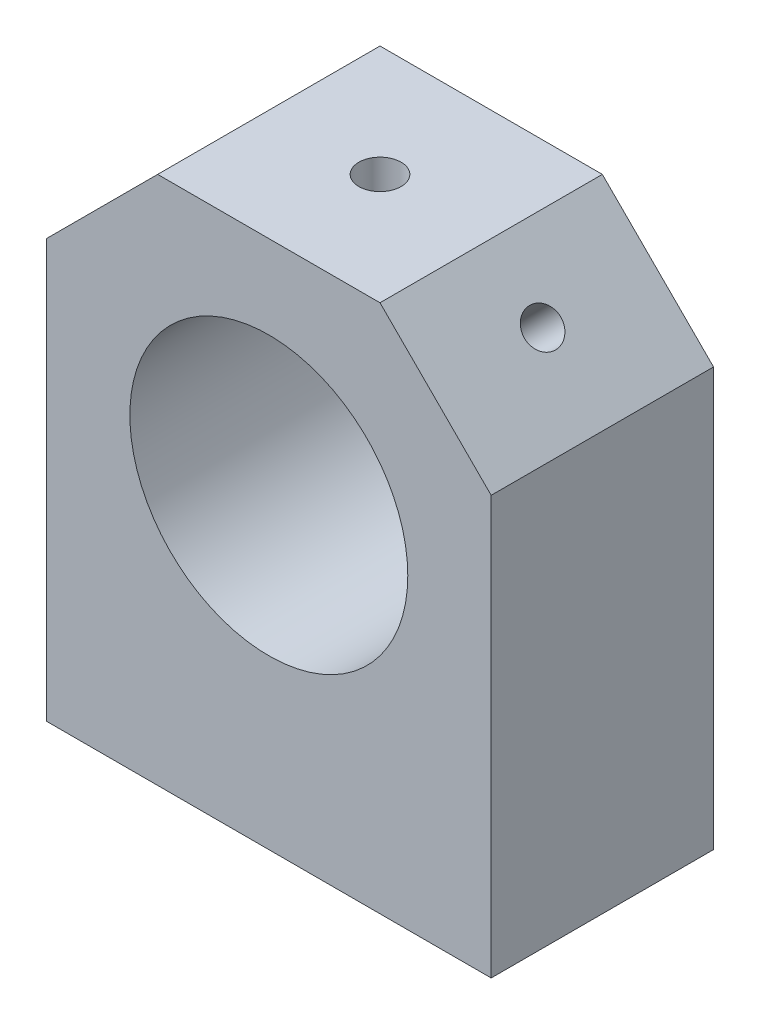
ISO-10303-21;
HEADER;
FILE_DESCRIPTION(('STEP AP214'),'2;1');
FILE_NAME('part.step','',(''),(''),'','','');
FILE_SCHEMA(('AUTOMOTIVE_DESIGN { 1 0 10303 214 1 1 1 1 }'));
ENDSEC;
DATA;
#1=APPLICATION_CONTEXT('core data for automotive mechanical design processes');
#2=APPLICATION_PROTOCOL_DEFINITION('international standard','automotive_design',2000,#1);
#3=PRODUCT_CONTEXT('',#1,'mechanical');
#4=PRODUCT('Part','Part','',(#3));
#5=PRODUCT_RELATED_PRODUCT_CATEGORY('part','',(#4));
#6=PRODUCT_DEFINITION_FORMATION('','',#4);
#7=PRODUCT_DEFINITION_CONTEXT('part definition',#1,'design');
#8=PRODUCT_DEFINITION('design','',#6,#7);
#9=PRODUCT_DEFINITION_SHAPE('','',#8);
#10=(LENGTH_UNIT() NAMED_UNIT(*) SI_UNIT(.MILLI.,.METRE.));
#11=(NAMED_UNIT(*) PLANE_ANGLE_UNIT() SI_UNIT($,.RADIAN.));
#12=(NAMED_UNIT(*) SI_UNIT($,.STERADIAN.) SOLID_ANGLE_UNIT());
#13=UNCERTAINTY_MEASURE_WITH_UNIT(LENGTH_MEASURE(1.E-05),#10,'distance_accuracy_value','');
#14=(GEOMETRIC_REPRESENTATION_CONTEXT(3) GLOBAL_UNCERTAINTY_ASSIGNED_CONTEXT((#13)) GLOBAL_UNIT_ASSIGNED_CONTEXT((#10,
#11,#12)) REPRESENTATION_CONTEXT('',''));
#15=CARTESIAN_POINT('',(0.,0.,0.));
#16=DIRECTION('',(0.,0.,1.));
#17=DIRECTION('',(1.,0.,0.));
#18=AXIS2_PLACEMENT_3D('',#15,#16,#17);
#19=CARTESIAN_POINT('',(0.,0.,25.4));
#20=DIRECTION('',(0.,0.,1.));
#21=DIRECTION('',(1.,0.,0.));
#22=AXIS2_PLACEMENT_3D('',#19,#20,#21);
#23=PLANE('',#22);
#24=DIRECTION('',(0.,1.,0.));
#25=VECTOR('',#24,1.);
#26=CARTESIAN_POINT('',(0.,0.,25.4));
#27=LINE('',#26,#25);
#28=CARTESIAN_POINT('',(0.,0.,25.4));
#29=VERTEX_POINT('',#28);
#30=CARTESIAN_POINT('',(0.,47.752,25.4));
#31=VERTEX_POINT('',#30);
#32=EDGE_CURVE('E157',#29,#31,#27,.T.);
#33=ORIENTED_EDGE('',*,*,#32,.T.);
#34=DIRECTION('',(-0.707106781186552,0.707106781186543,0.));
#35=VECTOR('',#34,1.);
#36=CARTESIAN_POINT('',(-12.7000000000001,60.452,25.4));
#37=LINE('',#36,#35);
#38=CARTESIAN_POINT('',(-12.7000000000001,60.452,25.4));
#39=VERTEX_POINT('',#38);
#40=EDGE_CURVE('E105',#31,#39,#37,.T.);
#41=ORIENTED_EDGE('',*,*,#40,.T.);
#42=DIRECTION('',(-1.,0.,0.));
#43=VECTOR('',#42,1.);
#44=CARTESIAN_POINT('',(-12.7000000000001,60.452,25.4));
#45=LINE('',#44,#43);
#46=CARTESIAN_POINT('',(-38.1000000000001,60.452,25.4));
#47=VERTEX_POINT('',#46);
#48=EDGE_CURVE('E118',#39,#47,#45,.T.);
#49=ORIENTED_EDGE('',*,*,#48,.T.);
#50=DIRECTION('',(-0.707106781186546,-0.707106781186549,0.));
#51=VECTOR('',#50,1.);
#52=CARTESIAN_POINT('',(-38.1000000000001,60.452,25.4));
#53=LINE('',#52,#51);
#54=CARTESIAN_POINT('',(-50.8,47.752,25.4));
#55=VERTEX_POINT('',#54);
#56=EDGE_CURVE('E112',#47,#55,#53,.T.);
#57=ORIENTED_EDGE('',*,*,#56,.T.);
#58=DIRECTION('',(0.,-1.,0.));
#59=VECTOR('',#58,1.);
#60=CARTESIAN_POINT('',(-50.8,0.,25.4));
#61=LINE('',#60,#59);
#62=CARTESIAN_POINT('',(-50.8,0.,25.4));
#63=VERTEX_POINT('',#62);
#64=EDGE_CURVE('E116',#55,#63,#61,.T.);
#65=ORIENTED_EDGE('',*,*,#64,.T.);
#66=DIRECTION('',(1.,0.,0.));
#67=VECTOR('',#66,1.);
#68=CARTESIAN_POINT('',(0.,0.,25.4));
#69=LINE('',#68,#67);
#70=EDGE_CURVE('E68',#63,#29,#69,.T.);
#71=ORIENTED_EDGE('',*,*,#70,.T.);
#72=EDGE_LOOP('',(#33,#41,#49,#57,#65,#71));
#73=FACE_BOUND('',#72,.T.);
#74=CARTESIAN_POINT('',(-25.4,35.052,25.4));
#75=DIRECTION('',(0.,0.,1.));
#76=DIRECTION('',(1.,0.,0.));
#77=AXIS2_PLACEMENT_3D('',#74,#75,#76);
#78=CIRCLE('',#77,15.875);
#79=CARTESIAN_POINT('',(-9.525,35.052,25.4));
#80=VERTEX_POINT('',#79);
#81=EDGE_CURVE('E145',#80,#80,#78,.T.);
#82=ORIENTED_EDGE('',*,*,#81,.F.);
#83=EDGE_LOOP('',(#82));
#84=FACE_BOUND('',#83,.T.);
#85=ADVANCED_FACE('F43',(#73,#84),#23,.T.);
#86=CARTESIAN_POINT('',(0.,0.,0.));
#87=DIRECTION('',(0.,0.,1.));
#88=DIRECTION('',(1.,0.,0.));
#89=AXIS2_PLACEMENT_3D('',#86,#87,#88);
#90=PLANE('',#89);
#91=DIRECTION('',(0.,1.,0.));
#92=VECTOR('',#91,1.);
#93=CARTESIAN_POINT('',(0.,0.,0.));
#94=LINE('',#93,#92);
#95=CARTESIAN_POINT('',(0.,0.,0.));
#96=VERTEX_POINT('',#95);
#97=CARTESIAN_POINT('',(0.,47.752,0.));
#98=VERTEX_POINT('',#97);
#99=EDGE_CURVE('E140',#96,#98,#94,.T.);
#100=ORIENTED_EDGE('',*,*,#99,.F.);
#101=DIRECTION('',(1.,0.,0.));
#102=VECTOR('',#101,1.);
#103=CARTESIAN_POINT('',(0.,0.,0.));
#104=LINE('',#103,#102);
#105=CARTESIAN_POINT('',(-50.8,0.,0.));
#106=VERTEX_POINT('',#105);
#107=EDGE_CURVE('E97',#106,#96,#104,.T.);
#108=ORIENTED_EDGE('',*,*,#107,.F.);
#109=DIRECTION('',(0.,-1.,0.));
#110=VECTOR('',#109,1.);
#111=CARTESIAN_POINT('',(-50.8,0.,0.));
#112=LINE('',#111,#110);
#113=CARTESIAN_POINT('',(-50.8,47.752,0.));
#114=VERTEX_POINT('',#113);
#115=EDGE_CURVE('E91',#114,#106,#112,.T.);
#116=ORIENTED_EDGE('',*,*,#115,.F.);
#117=DIRECTION('',(-0.707106781186546,-0.707106781186549,0.));
#118=VECTOR('',#117,1.);
#119=CARTESIAN_POINT('',(-38.1000000000001,60.452,0.));
#120=LINE('',#119,#118);
#121=CARTESIAN_POINT('',(-38.1000000000001,60.452,0.));
#122=VERTEX_POINT('',#121);
#123=EDGE_CURVE('E127',#122,#114,#120,.T.);
#124=ORIENTED_EDGE('',*,*,#123,.F.);
#125=DIRECTION('',(-1.,0.,0.));
#126=VECTOR('',#125,1.);
#127=CARTESIAN_POINT('',(-12.7000000000001,60.452,0.));
#128=LINE('',#127,#126);
#129=CARTESIAN_POINT('',(-12.7000000000001,60.452,0.));
#130=VERTEX_POINT('',#129);
#131=EDGE_CURVE('E148',#130,#122,#128,.T.);
#132=ORIENTED_EDGE('',*,*,#131,.F.);
#133=DIRECTION('',(-0.707106781186552,0.707106781186543,0.));
#134=VECTOR('',#133,1.);
#135=CARTESIAN_POINT('',(-12.7000000000001,60.452,0.));
#136=LINE('',#135,#134);
#137=EDGE_CURVE('E144',#98,#130,#136,.T.);
#138=ORIENTED_EDGE('',*,*,#137,.F.);
#139=EDGE_LOOP('',(#100,#108,#116,#124,#132,#138));
#140=FACE_BOUND('',#139,.T.);
#141=CARTESIAN_POINT('',(-25.4,35.052,0.));
#142=DIRECTION('',(0.,0.,1.));
#143=DIRECTION('',(1.,0.,0.));
#144=AXIS2_PLACEMENT_3D('',#141,#142,#143);
#145=CIRCLE('',#144,15.875);
#146=CARTESIAN_POINT('',(-9.525,35.052,0.));
#147=VERTEX_POINT('',#146);
#148=EDGE_CURVE('E174',#147,#147,#145,.T.);
#149=ORIENTED_EDGE('',*,*,#148,.T.);
#150=EDGE_LOOP('',(#149));
#151=FACE_BOUND('',#150,.T.);
#152=ADVANCED_FACE('F201',(#140,#151),#90,.F.);
#153=CARTESIAN_POINT('',(0.,0.,25.4));
#154=DIRECTION('',(-1.,0.,0.));
#155=DIRECTION('',(0.,0.,1.));
#156=AXIS2_PLACEMENT_3D('',#153,#154,#155);
#157=PLANE('',#156);
#158=ORIENTED_EDGE('',*,*,#99,.T.);
#159=DIRECTION('',(0.,0.,-1.));
#160=VECTOR('',#159,1.);
#161=CARTESIAN_POINT('',(0.,47.752,25.4));
#162=LINE('',#161,#160);
#163=EDGE_CURVE('E11',#31,#98,#162,.T.);
#164=ORIENTED_EDGE('',*,*,#163,.F.);
#165=ORIENTED_EDGE('',*,*,#32,.F.);
#166=DIRECTION('',(0.,0.,-1.));
#167=VECTOR('',#166,1.);
#168=CARTESIAN_POINT('',(0.,0.,25.4));
#169=LINE('',#168,#167);
#170=EDGE_CURVE('E136',#29,#96,#169,.T.);
#171=ORIENTED_EDGE('',*,*,#170,.T.);
#172=EDGE_LOOP('',(#158,#164,#165,#171));
#173=FACE_BOUND('',#172,.T.);
#174=ADVANCED_FACE('F45',(#173),#157,.F.);
#175=CARTESIAN_POINT('',(-12.7000000000001,60.452,25.4));
#176=DIRECTION('',(-0.707106781186543,-0.707106781186552,0.));
#177=DIRECTION('',(0.707106781186552,-0.707106781186543,0.));
#178=AXIS2_PLACEMENT_3D('',#175,#176,#177);
#179=PLANE('',#178);
#180=CARTESIAN_POINT('',(-6.8249946520126,54.5769946520126,12.7));
#181=DIRECTION('',(0.707106781186543,0.707106781186552,0.));
#182=DIRECTION('',(-0.707106781186552,0.707106781186543,0.));
#183=AXIS2_PLACEMENT_3D('',#180,#181,#182);
#184=CIRCLE('',#183,2.08279999999999);
#185=CARTESIAN_POINT('',(-8.29775665586794,56.0497566558679,12.7));
#186=VERTEX_POINT('',#185);
#187=EDGE_CURVE('E228',#186,#186,#184,.T.);
#188=ORIENTED_EDGE('',*,*,#187,.F.);
#189=EDGE_LOOP('',(#188));
#190=FACE_BOUND('',#189,.T.);
#191=ORIENTED_EDGE('',*,*,#137,.T.);
#192=DIRECTION('',(0.,0.,-1.));
#193=VECTOR('',#192,1.);
#194=CARTESIAN_POINT('',(-12.7000000000001,60.452,25.4));
#195=LINE('',#194,#193);
#196=EDGE_CURVE('E59',#39,#130,#195,.T.);
#197=ORIENTED_EDGE('',*,*,#196,.F.);
#198=ORIENTED_EDGE('',*,*,#40,.F.);
#199=ORIENTED_EDGE('',*,*,#163,.T.);
#200=EDGE_LOOP('',(#191,#197,#198,#199));
#201=FACE_BOUND('',#200,.T.);
#202=ADVANCED_FACE('F218',(#190,#201),#179,.F.);
#203=CARTESIAN_POINT('',(-12.7000000000001,60.452,25.4));
#204=DIRECTION('',(0.,-1.,0.));
#205=DIRECTION('',(1.,0.,0.));
#206=AXIS2_PLACEMENT_3D('',#203,#204,#205);
#207=PLANE('',#206);
#208=CARTESIAN_POINT('',(-25.4000000000001,60.452,12.7));
#209=DIRECTION('',(0.,1.,0.));
#210=DIRECTION('',(0.,0.,1.));
#211=AXIS2_PLACEMENT_3D('',#208,#209,#210);
#212=CIRCLE('',#211,2.41299999999999);
#213=CARTESIAN_POINT('',(-25.4000000000001,60.452,15.113));
#214=VERTEX_POINT('',#213);
#215=EDGE_CURVE('E175',#214,#214,#212,.T.);
#216=ORIENTED_EDGE('',*,*,#215,.F.);
#217=EDGE_LOOP('',(#216));
#218=FACE_BOUND('',#217,.T.);
#219=ORIENTED_EDGE('',*,*,#131,.T.);
#220=DIRECTION('',(0.,0.,-1.));
#221=VECTOR('',#220,1.);
#222=CARTESIAN_POINT('',(-38.1000000000001,60.452,25.4));
#223=LINE('',#222,#221);
#224=EDGE_CURVE('E129',#47,#122,#223,.T.);
#225=ORIENTED_EDGE('',*,*,#224,.F.);
#226=ORIENTED_EDGE('',*,*,#48,.F.);
#227=ORIENTED_EDGE('',*,*,#196,.T.);
#228=EDGE_LOOP('',(#219,#225,#226,#227));
#229=FACE_BOUND('',#228,.T.);
#230=ADVANCED_FACE('F215',(#218,#229),#207,.F.);
#231=CARTESIAN_POINT('',(-38.1000000000001,60.452,25.4));
#232=DIRECTION('',(0.707106781186549,-0.707106781186546,0.));
#233=DIRECTION('',(0.707106781186546,0.707106781186549,0.));
#234=AXIS2_PLACEMENT_3D('',#231,#232,#233);
#235=PLANE('',#234);
#236=CARTESIAN_POINT('',(-44.9249946520126,53.6270053479874,12.7));
#237=DIRECTION('',(-0.707106781186549,0.707106781186546,0.));
#238=DIRECTION('',(-0.707106781186546,-0.707106781186549,0.));
#239=AXIS2_PLACEMENT_3D('',#236,#237,#238);
#240=CIRCLE('',#239,2.0828);
#241=CARTESIAN_POINT('',(-46.397756655868,52.1542433441321,12.7));
#242=VERTEX_POINT('',#241);
#243=EDGE_CURVE('E250',#242,#242,#240,.T.);
#244=ORIENTED_EDGE('',*,*,#243,.F.);
#245=EDGE_LOOP('',(#244));
#246=FACE_BOUND('',#245,.T.);
#247=ORIENTED_EDGE('',*,*,#123,.T.);
#248=DIRECTION('',(0.,0.,-1.));
#249=VECTOR('',#248,1.);
#250=CARTESIAN_POINT('',(-50.8,47.752,25.4));
#251=LINE('',#250,#249);
#252=EDGE_CURVE('E124',#55,#114,#251,.T.);
#253=ORIENTED_EDGE('',*,*,#252,.F.);
#254=ORIENTED_EDGE('',*,*,#56,.F.);
#255=ORIENTED_EDGE('',*,*,#224,.T.);
#256=EDGE_LOOP('',(#247,#253,#254,#255));
#257=FACE_BOUND('',#256,.T.);
#258=ADVANCED_FACE('F125',(#246,#257),#235,.F.);
#259=CARTESIAN_POINT('',(-50.8,0.,25.4));
#260=DIRECTION('',(1.,0.,0.));
#261=DIRECTION('',(0.,0.,-1.));
#262=AXIS2_PLACEMENT_3D('',#259,#260,#261);
#263=PLANE('',#262);
#264=ORIENTED_EDGE('',*,*,#115,.T.);
#265=DIRECTION('',(0.,0.,-1.));
#266=VECTOR('',#265,1.);
#267=CARTESIAN_POINT('',(-50.8,0.,25.4));
#268=LINE('',#267,#266);
#269=EDGE_CURVE('E130',#63,#106,#268,.T.);
#270=ORIENTED_EDGE('',*,*,#269,.F.);
#271=ORIENTED_EDGE('',*,*,#64,.F.);
#272=ORIENTED_EDGE('',*,*,#252,.T.);
#273=EDGE_LOOP('',(#264,#270,#271,#272));
#274=FACE_BOUND('',#273,.T.);
#275=ADVANCED_FACE('F132',(#274),#263,.F.);
#276=CARTESIAN_POINT('',(0.,0.,25.4));
#277=DIRECTION('',(0.,1.,0.));
#278=DIRECTION('',(0.,0.,1.));
#279=AXIS2_PLACEMENT_3D('',#276,#277,#278);
#280=PLANE('',#279);
#281=ORIENTED_EDGE('',*,*,#107,.T.);
#282=ORIENTED_EDGE('',*,*,#170,.F.);
#283=ORIENTED_EDGE('',*,*,#70,.F.);
#284=ORIENTED_EDGE('',*,*,#269,.T.);
#285=EDGE_LOOP('',(#281,#282,#283,#284));
#286=FACE_BOUND('',#285,.T.);
#287=ADVANCED_FACE('F208',(#286),#280,.F.);
#288=CARTESIAN_POINT('',(-25.4,35.052,25.4));
#289=DIRECTION('',(0.,0.,-1.));
#290=DIRECTION('',(-1.,0.,0.));
#291=AXIS2_PLACEMENT_3D('',#288,#289,#290);
#292=CYLINDRICAL_SURFACE('',#291,15.875);
#293=CARTESIAN_POINT('',(-16.2927100024375,48.0548033092983,12.7));
#294=CARTESIAN_POINT('',(-16.2927050720651,48.0548011733864,12.5840463750659));
#295=CARTESIAN_POINT('',(-16.2846217681134,48.0491498059719,12.4680211828327));
#296=CARTESIAN_POINT('',(-16.2525920227488,48.0266260256447,12.2392170107938));
#297=CARTESIAN_POINT('',(-16.2286291986686,48.0097420241175,12.1264415091625));
#298=CARTESIAN_POINT('',(-16.1658187770765,47.9650553099287,11.9074960299914));
#299=CARTESIAN_POINT('',(-16.1269842941601,47.9372622169286,11.8013203280233));
#300=CARTESIAN_POINT('',(-16.0359213861988,47.8712357421164,11.5984090323196));
#301=CARTESIAN_POINT('',(-15.9836948691861,47.833003847524,11.5016720965024));
#302=CARTESIAN_POINT('',(-15.8672040139145,47.7463581130501,11.3193783513828));
#303=CARTESIAN_POINT('',(-15.802834225104,47.6978545855876,11.2339315620008));
#304=CARTESIAN_POINT('',(-15.6646165575232,47.5917571950305,11.0775757665023));
#305=CARTESIAN_POINT('',(-15.5907678909041,47.534162576227,11.0066679700864));
#306=CARTESIAN_POINT('',(-15.4353198059716,47.4104270463784,10.8807497659083));
#307=CARTESIAN_POINT('',(-15.3536540760266,47.3442109129028,10.8258950044019));
#308=CARTESIAN_POINT('',(-15.1858326562051,47.2051179277914,10.7345759382728));
#309=CARTESIAN_POINT('',(-15.0996770793642,47.1322412438058,10.6981111709133));
#310=CARTESIAN_POINT('',(-14.9259554126967,46.9819264968628,10.644794560961));
#311=CARTESIAN_POINT('',(-14.8383966905746,46.9045086922687,10.6278616780001));
#312=CARTESIAN_POINT('',(-14.6641687889873,46.7469281713973,10.6138977021372));
#313=CARTESIAN_POINT('',(-14.5774995531169,46.6667656305886,10.6168653393673));
#314=CARTESIAN_POINT('',(-14.4083757490239,46.5068348175603,10.6425389689042));
#315=CARTESIAN_POINT('',(-14.3258883709987,46.4270703012398,10.6650525766123));
#316=CARTESIAN_POINT('',(-14.166421309728,46.2696155200845,10.7289346745719));
#317=CARTESIAN_POINT('',(-14.0894415715107,46.1919252345515,10.7703029766042));
#318=CARTESIAN_POINT('',(-13.9430367111155,46.0412965059779,10.8706021412744));
#319=CARTESIAN_POINT('',(-13.8735954793047,45.9683480692185,10.929494505181));
#320=CARTESIAN_POINT('',(-13.7436183832162,45.8294512040953,11.0632074635144));
#321=CARTESIAN_POINT('',(-13.6830828222893,45.7635030141998,11.1380286003054));
#322=CARTESIAN_POINT('',(-13.5718452981218,45.64054605993,11.301953595574));
#323=CARTESIAN_POINT('',(-13.5211988589373,45.5835880965669,11.3911332430368));
#324=CARTESIAN_POINT('',(-13.4311140468052,45.4810970130984,11.5809804822694));
#325=CARTESIAN_POINT('',(-13.3916758634065,45.4355640862095,11.6816482682811));
#326=CARTESIAN_POINT('',(-13.3246079566339,45.3574937722672,11.8919800888176));
#327=CARTESIAN_POINT('',(-13.2970151900869,45.3249970776725,12.0016710245678));
#328=CARTESIAN_POINT('',(-13.2542950719204,45.2744547595542,12.2266656653231));
#329=CARTESIAN_POINT('',(-13.2391674301241,45.2564087996308,12.341969239605));
#330=CARTESIAN_POINT('',(-13.2216596407273,45.2355082373085,12.5745528489555));
#331=CARTESIAN_POINT('',(-13.2192420332007,45.2326089935778,12.6918260528759));
#332=CARTESIAN_POINT('',(-13.2270940184724,45.2419961107811,12.9253340932832));
#333=CARTESIAN_POINT('',(-13.2373634769194,45.2542823109068,13.0415689407528));
#334=CARTESIAN_POINT('',(-13.2703822625837,45.2935158434956,13.2694593697312));
#335=CARTESIAN_POINT('',(-13.2931061559933,45.3204332958463,13.3811237869689));
#336=CARTESIAN_POINT('',(-13.3506306754186,45.3878732866736,13.5969841559818));
#337=CARTESIAN_POINT('',(-13.385431602405,45.4283961642089,13.7011799215533));
#338=CARTESIAN_POINT('',(-13.4666253797125,45.5216712145351,13.8994905512324));
#339=CARTESIAN_POINT('',(-13.5130530601735,45.574460097553,13.9935738890156));
#340=CARTESIAN_POINT('',(-13.6165885495664,45.690273199898,14.1686572672583));
#341=CARTESIAN_POINT('',(-13.6736965147126,45.7532975689319,14.249657116321));
#342=CARTESIAN_POINT('',(-13.7975719391149,45.8874799155307,14.396423595293));
#343=CARTESIAN_POINT('',(-13.8643572788231,45.9586528966834,14.4621614280387));
#344=CARTESIAN_POINT('',(-14.0060454746993,46.1065872805162,14.5763202032419));
#345=CARTESIAN_POINT('',(-14.0809480347441,46.1833484792999,14.6247417771343));
#346=CARTESIAN_POINT('',(-14.2367207447152,46.3395561154171,14.7026929560685));
#347=CARTESIAN_POINT('',(-14.3175624476658,46.4189888761031,14.7323068057139));
#348=CARTESIAN_POINT('',(-14.4834132611701,46.5783601632577,14.7721485195553));
#349=CARTESIAN_POINT('',(-14.5684222352498,46.6582986730889,14.7823770181679));
#350=CARTESIAN_POINT('',(-14.7398689431014,46.8159591811427,14.7831954514503));
#351=CARTESIAN_POINT('',(-14.8262987646792,46.8936893704085,14.7738714170095));
#352=CARTESIAN_POINT('',(-14.9984460225483,47.0451835841492,14.7360884035477));
#353=CARTESIAN_POINT('',(-15.0841634381052,47.1189474935256,14.7076288695528));
#354=CARTESIAN_POINT('',(-15.2526977616442,47.2610169733137,14.6322609419246));
#355=CARTESIAN_POINT('',(-15.3354991703222,47.3292953042081,14.5852665977328));
#356=CARTESIAN_POINT('',(-15.4951771820542,47.458476957388,14.4741872758685));
#357=CARTESIAN_POINT('',(-15.5720535614859,47.519380001365,14.410101653544));
#358=CARTESIAN_POINT('',(-15.7180897670185,47.6331328032716,14.2659077433207));
#359=CARTESIAN_POINT('',(-15.7871672343149,47.6858984382331,14.1856496242532));
#360=CARTESIAN_POINT('',(-15.9143521849094,47.7816687303308,14.0116954603516));
#361=CARTESIAN_POINT('',(-15.9724571685094,47.8246711637119,13.9179963619928));
#362=CARTESIAN_POINT('',(-16.0756350162291,47.9001885669798,13.7196085055858));
#363=CARTESIAN_POINT('',(-16.1206871577636,47.9326868699471,13.6149026284802));
#364=CARTESIAN_POINT('',(-16.1958464131021,47.9865018537655,13.397643084406));
#365=CARTESIAN_POINT('',(-16.2259704347152,48.0078311863172,13.2850984613284));
#366=CARTESIAN_POINT('',(-16.2628425535798,48.0338446200389,13.0932953588844));
#367=CARTESIAN_POINT('',(-16.2740213599672,48.0416967966334,13.0152755461339));
#368=CARTESIAN_POINT('',(-16.2889567110918,48.0521768310492,12.8581815819559));
#369=CARTESIAN_POINT('',(-16.2927133661026,48.0548047664889,12.7791074462105));
#370=CARTESIAN_POINT('',(-16.2927100024375,48.0548033092983,12.7));
#371=B_SPLINE_CURVE_WITH_KNOTS('',3,(#293,#294,#295,#296,#297,#298,#299,#300,#301,#302,#303,
#304,#305,#306,#307,#308,#309,#310,#311,#312,#313,#314,#315,#316,#317,#318,#319,#320,#321,#322,
#323,#324,#325,#326,#327,#328,#329,#330,#331,#332,#333,#334,#335,#336,#337,#338,#339,#340,#341,
#342,#343,#344,#345,#346,#347,#348,#349,#350,#351,#352,#353,#354,#355,#356,#357,#358,#359,#360,
#361,#362,#363,#364,#365,#366,#367,#368,#369,#370),.UNSPECIFIED.,.T.,.F.,(4,2,2,2,2,2,2,2,2,2,2,
2,2,2,2,2,2,2,2,2,2,2,2,2,2,2,2,2,2,2,2,2,2,2,2,2,2,2,4),(0.,0.347570573662195,
0.695500290201438,1.04312388830707,1.39069798617427,1.7414422586576,2.09221570259164,
2.44628530513808,2.80034599799112,3.15293230128705,3.50549610598611,3.854628584191,
4.20375757721737,4.552125159116,4.90050460459551,5.25078712968843,5.60107557824649,
5.95244909561217,6.30381443309106,6.65414361848395,7.00446909405016,7.35408180424735,
7.70370322773548,8.05438480641353,8.40507151470795,8.75641463454417,9.10774494139666,
9.45749023982664,9.8072240920824,10.1554223494108,10.503630705734,10.8534731437385,
11.2033287790313,11.5565884576673,11.9099285173851,12.2638265010288,12.6173227332116,
12.8544505418003,13.0915748272721),.UNSPECIFIED.);
#372=CARTESIAN_POINT('',(-16.2927100024375,48.0548033092983,12.7));
#373=VERTEX_POINT('',#372);
#374=EDGE_CURVE('E47',#373,#373,#371,.T.);
#375=ORIENTED_EDGE('',*,*,#374,.F.);
#376=EDGE_LOOP('',(#375));
#377=FACE_BOUND('',#376,.T.);
#378=CARTESIAN_POINT('',(-38.4028033092983,44.1592899975624,12.7));
#379=CARTESIAN_POINT('',(-38.4028011733864,44.1592949279348,12.5840463750659));
#380=CARTESIAN_POINT('',(-38.397149805972,44.1673782318866,12.4680211828327));
#381=CARTESIAN_POINT('',(-38.3746260256447,44.1994079772511,12.2392170107938));
#382=CARTESIAN_POINT('',(-38.3577420241176,44.2233708013313,12.1264415091625));
#383=CARTESIAN_POINT('',(-38.3130553099287,44.2861812229234,11.9074960299914));
#384=CARTESIAN_POINT('',(-38.2852622169286,44.3250157058398,11.8013203280233));
#385=CARTESIAN_POINT('',(-38.2192357421164,44.4160786138012,11.5984090323196));
#386=CARTESIAN_POINT('',(-38.1810038475241,44.4683051308138,11.5016720965024));
#387=CARTESIAN_POINT('',(-38.0943581130502,44.5847959860854,11.3193783513828));
#388=CARTESIAN_POINT('',(-38.0458545855877,44.6491657748959,11.2339315620008));
#389=CARTESIAN_POINT('',(-37.9397571950306,44.7873834424767,11.0775757665023));
#390=CARTESIAN_POINT('',(-37.882162576227,44.8612321090958,11.0066679700864));
#391=CARTESIAN_POINT('',(-37.7584270463785,45.0166801940283,10.8807497659083));
#392=CARTESIAN_POINT('',(-37.6922109129028,45.0983459239733,10.8258950044019));
#393=CARTESIAN_POINT('',(-37.5531179277915,45.2661673437948,10.7345759382728));
#394=CARTESIAN_POINT('',(-37.4802412438058,45.3523229206357,10.6981111709132));
#395=CARTESIAN_POINT('',(-37.3299264968629,45.5260445873032,10.644794560961));
#396=CARTESIAN_POINT('',(-37.2525086922687,45.6136033094254,10.6278616780001));
#397=CARTESIAN_POINT('',(-37.0949281713973,45.7878312110126,10.6138977021372));
#398=CARTESIAN_POINT('',(-37.0147656305886,45.874500446883,10.6168653393673));
#399=CARTESIAN_POINT('',(-36.8548348175603,46.043624250976,10.6425389689042));
#400=CARTESIAN_POINT('',(-36.7750703012399,46.1261116290012,10.6650525766123));
#401=CARTESIAN_POINT('',(-36.6176155200845,46.2855786902719,10.7289346745718));
#402=CARTESIAN_POINT('',(-36.5399252345515,46.3625584284892,10.7703029766042));
#403=CARTESIAN_POINT('',(-36.389296505978,46.5089632888845,10.8706021412744));
#404=CARTESIAN_POINT('',(-36.3163480692186,46.5784045206952,10.929494505181));
#405=CARTESIAN_POINT('',(-36.1774512040954,46.7083816167837,11.0632074635144));
#406=CARTESIAN_POINT('',(-36.1115030141999,46.7689171777106,11.1380286003054));
#407=CARTESIAN_POINT('',(-35.98854605993,46.8801547018782,11.301953595574));
#408=CARTESIAN_POINT('',(-35.9315880965669,46.9308011410627,11.3911332430368));
#409=CARTESIAN_POINT('',(-35.8290970130984,47.0208859531947,11.5809804822694));
#410=CARTESIAN_POINT('',(-35.7835640862095,47.0603241365934,11.681648268281));
#411=CARTESIAN_POINT('',(-35.7054937722673,47.1273920433661,11.8919800888176));
#412=CARTESIAN_POINT('',(-35.6729970776726,47.1549848099131,12.0016710245678));
#413=CARTESIAN_POINT('',(-35.6224547595542,47.1977049280796,12.2266656653231));
#414=CARTESIAN_POINT('',(-35.6044087996308,47.2128325698759,12.3419692396049));
#415=CARTESIAN_POINT('',(-35.5835082373086,47.2303403592726,12.5745528489555));
#416=CARTESIAN_POINT('',(-35.5806089935778,47.2327579667992,12.6918260528759));
#417=CARTESIAN_POINT('',(-35.5899961107811,47.2249059815275,12.9253340932832));
#418=CARTESIAN_POINT('',(-35.6022823109068,47.2146365230806,13.0415689407528));
#419=CARTESIAN_POINT('',(-35.6415158434956,47.1816177374162,13.2694593697312));
#420=CARTESIAN_POINT('',(-35.6684332958463,47.1588938440067,13.3811237869689));
#421=CARTESIAN_POINT('',(-35.7358732866736,47.1013693245813,13.5969841559818));
#422=CARTESIAN_POINT('',(-35.776396164209,47.066568397595,13.7011799215533));
#423=CARTESIAN_POINT('',(-35.8696712145352,46.9853746202874,13.8994905512324));
#424=CARTESIAN_POINT('',(-35.9224600975531,46.9389469398265,13.9935738890156));
#425=CARTESIAN_POINT('',(-36.0382731998981,46.8354114504336,14.1686572672583));
#426=CARTESIAN_POINT('',(-36.1012975689319,46.7783034852873,14.249657116321));
#427=CARTESIAN_POINT('',(-36.2354799155308,46.654428060885,14.396423595293));
#428=CARTESIAN_POINT('',(-36.3066528966834,46.5876427211768,14.4621614280388));
#429=CARTESIAN_POINT('',(-36.4545872805162,46.4459545253007,14.5763202032419));
#430=CARTESIAN_POINT('',(-36.5313484793,46.3710519652558,14.6247417771343));
#431=CARTESIAN_POINT('',(-36.6875561154171,46.2152792552847,14.7026929560685));
#432=CARTESIAN_POINT('',(-36.7669888761031,46.1344375523341,14.7323068057139));
#433=CARTESIAN_POINT('',(-36.9263601632577,45.9685867388298,14.7721485195553));
#434=CARTESIAN_POINT('',(-37.006298673089,45.8835777647502,14.7823770181679));
#435=CARTESIAN_POINT('',(-37.1639591811427,45.7121310568985,14.7831954514503));
#436=CARTESIAN_POINT('',(-37.2416893704086,45.6257012353208,14.7738714170095));
#437=CARTESIAN_POINT('',(-37.3931835841492,45.4535539774516,14.7360884035477));
#438=CARTESIAN_POINT('',(-37.4669474935256,45.3678365618947,14.7076288695528));
#439=CARTESIAN_POINT('',(-37.6090169733137,45.1993022383558,14.6322609419246));
#440=CARTESIAN_POINT('',(-37.6772953042082,45.1165008296777,14.5852665977328));
#441=CARTESIAN_POINT('',(-37.8064769573881,44.9568228179457,14.4741872758685));
#442=CARTESIAN_POINT('',(-37.867380001365,44.8799464385141,14.410101653544));
#443=CARTESIAN_POINT('',(-37.9811328032717,44.7339102329814,14.2659077433207));
#444=CARTESIAN_POINT('',(-38.0338984382332,44.664832765685,14.1856496242532));
#445=CARTESIAN_POINT('',(-38.1296687303309,44.5376478150905,14.0116954603516));
#446=CARTESIAN_POINT('',(-38.172671163712,44.4795428314906,13.9179963619928));
#447=CARTESIAN_POINT('',(-38.2481885669798,44.3763649837708,13.7196085055858));
#448=CARTESIAN_POINT('',(-38.2806868699472,44.3313128422363,13.6149026284802));
#449=CARTESIAN_POINT('',(-38.3345018537656,44.2561535868978,13.397643084406));
#450=CARTESIAN_POINT('',(-38.3558311863173,44.2260295652847,13.2850984613284));
#451=CARTESIAN_POINT('',(-38.381844620039,44.1891574464201,13.0932953588844));
#452=CARTESIAN_POINT('',(-38.3896967966335,44.1779786400327,13.0152755461339));
#453=CARTESIAN_POINT('',(-38.4001768310493,44.1630432889081,12.8581815819559));
#454=CARTESIAN_POINT('',(-38.4028047664889,44.1592866338973,12.7791074462105));
#455=CARTESIAN_POINT('',(-38.4028033092983,44.1592899975624,12.7));
#456=B_SPLINE_CURVE_WITH_KNOTS('',3,(#378,#379,#380,#381,#382,#383,#384,#385,#386,#387,#388,
#389,#390,#391,#392,#393,#394,#395,#396,#397,#398,#399,#400,#401,#402,#403,#404,#405,#406,#407,
#408,#409,#410,#411,#412,#413,#414,#415,#416,#417,#418,#419,#420,#421,#422,#423,#424,#425,#426,
#427,#428,#429,#430,#431,#432,#433,#434,#435,#436,#437,#438,#439,#440,#441,#442,#443,#444,#445,
#446,#447,#448,#449,#450,#451,#452,#453,#454,#455),.UNSPECIFIED.,.T.,.F.,(4,2,2,2,2,2,2,2,2,2,2,
2,2,2,2,2,2,2,2,2,2,2,2,2,2,2,2,2,2,2,2,2,2,2,2,2,2,2,4),(0.,0.347570573662197,0.69550029020144,
1.04312388830707,1.39069798617427,1.7414422586576,2.09221570259164,2.44628530513809,
2.80034599799114,3.15293230128706,3.50549610598612,3.85462858419102,4.20375757721739,
4.55212515911602,4.90050460459552,5.25078712968844,5.6010755782465,5.95244909561219,
6.30381443309107,6.65414361848397,7.00446909405017,7.35408180424737,7.70370322773551,
8.05438480641355,8.40507151470797,8.7564146345442,9.10774494139669,9.45749023982667,
9.80722409208242,10.1554223494109,10.5036307057341,10.8534731437385,11.2033287790314,
11.5565884576674,11.9099285173852,12.2638265010288,12.6173227332116,12.8544505418004,
13.0915748272721),.UNSPECIFIED.);
#457=CARTESIAN_POINT('',(-38.4028033092983,44.1592899975624,12.7));
#458=VERTEX_POINT('',#457);
#459=EDGE_CURVE('E176',#458,#458,#456,.T.);
#460=ORIENTED_EDGE('',*,*,#459,.F.);
#461=EDGE_LOOP('',(#460));
#462=FACE_BOUND('',#461,.T.);
#463=CARTESIAN_POINT('',(-25.4000000000001,50.927,15.113));
#464=CARTESIAN_POINT('',(-25.5347067400021,50.9269978213949,15.1129944613459));
#465=CARTESIAN_POINT('',(-25.6694911120328,50.9252674699941,15.1016818256067));
#466=CARTESIAN_POINT('',(-25.9352909582565,50.9185312992212,15.0567424798264));
#467=CARTESIAN_POINT('',(-26.066302658029,50.9135223109544,15.0230941812958));
#468=CARTESIAN_POINT('',(-26.3206721644965,50.9007916407411,14.9345134072761));
#469=CARTESIAN_POINT('',(-26.4440357278824,50.8930720289563,14.8795971712859));
#470=CARTESIAN_POINT('',(-26.6797783822909,50.8757726410619,14.7500794097904));
#471=CARTESIAN_POINT('',(-26.7921589649643,50.866193118085,14.67548056258));
#472=CARTESIAN_POINT('',(-27.0036645812666,50.846152965096,14.5080783692575));
#473=CARTESIAN_POINT('',(-27.1026888552457,50.8356865130211,14.4151484010867));
#474=CARTESIAN_POINT('',(-27.283801463774,50.8150975894645,14.2139943941031));
#475=CARTESIAN_POINT('',(-27.3658888137136,50.8049751380094,14.1057694667503));
#476=CARTESIAN_POINT('',(-27.5111909924111,50.7861638332369,13.8764188889946));
#477=CARTESIAN_POINT('',(-27.5743080836498,50.7774825040762,13.7552306475084));
#478=CARTESIAN_POINT('',(-27.6792534340282,50.7626160107162,13.503819058271));
#479=CARTESIAN_POINT('',(-27.7210828849516,50.7564307067814,13.3735962167839));
#480=CARTESIAN_POINT('',(-27.7819521184921,50.7473139046385,13.1088726540439));
#481=CARTESIAN_POINT('',(-27.801164574437,50.7443577654993,12.9744125006151));
#482=CARTESIAN_POINT('',(-27.8167894243843,50.7419592189351,12.7041467668472));
#483=CARTESIAN_POINT('',(-27.8132031621882,50.7425166044159,12.5683412662766));
#484=CARTESIAN_POINT('',(-27.7834734353334,50.7470596013428,12.3004611128271));
#485=CARTESIAN_POINT('',(-27.7575224758892,50.7510159551003,12.1683645276995));
#486=CARTESIAN_POINT('',(-27.6841014416363,50.7618653913807,11.9104226172496));
#487=CARTESIAN_POINT('',(-27.6366307431353,50.7687585590191,11.784577473226));
#488=CARTESIAN_POINT('',(-27.5213181119942,50.7847371713111,11.5421260993693));
#489=CARTESIAN_POINT('',(-27.453394823488,50.7938313421778,11.4255591619771));
#490=CARTESIAN_POINT('',(-27.2991630243532,50.8131809974321,11.2054044605414));
#491=CARTESIAN_POINT('',(-27.212853275176,50.8234365600315,11.1018175716067));
#492=CARTESIAN_POINT('',(-27.0232427790608,50.8440826420283,10.9094478885602));
#493=CARTESIAN_POINT('',(-26.9197765615181,50.8544734653678,10.8208281431164));
#494=CARTESIAN_POINT('',(-26.6993536238521,50.8741214728234,10.6621856432317));
#495=CARTESIAN_POINT('',(-26.5823968417524,50.883378651731,10.5921629742314));
#496=CARTESIAN_POINT('',(-26.338170045873,50.8997263870546,10.4726931896245));
#497=CARTESIAN_POINT('',(-26.2108936801541,50.9068155960292,10.4232588632514));
#498=CARTESIAN_POINT('',(-25.9497138773689,50.9180174176117,10.3465118686857));
#499=CARTESIAN_POINT('',(-25.8158109011547,50.9221302369046,10.3191976644218));
#500=CARTESIAN_POINT('',(-25.546585900041,50.9268884532972,10.287683559037));
#501=CARTESIAN_POINT('',(-25.4112906820603,50.9275674697985,10.2832595366038));
#502=CARTESIAN_POINT('',(-25.1418906052268,50.9254731538663,10.2970561871062));
#503=CARTESIAN_POINT('',(-25.0077857086412,50.9226999312645,10.3152761396321));
#504=CARTESIAN_POINT('',(-24.7452534252521,50.9140335351611,10.3736571688059));
#505=CARTESIAN_POINT('',(-24.616801154185,50.9081559215045,10.4137088521248));
#506=CARTESIAN_POINT('',(-24.3684349106186,50.8939375836956,10.5145009180311));
#507=CARTESIAN_POINT('',(-24.2485213487076,50.8855967411969,10.5752422946822));
#508=CARTESIAN_POINT('',(-24.0196522920376,50.8672951236658,10.7162138895485));
#509=CARTESIAN_POINT('',(-23.9107851585808,50.8573227350709,10.7965860277733));
#510=CARTESIAN_POINT('',(-23.7080042688741,50.8369035905379,10.9743403585656));
#511=CARTESIAN_POINT('',(-23.6140914069398,50.8264568062773,11.0717235677222));
#512=CARTESIAN_POINT('',(-23.4430676454451,50.80615944189,11.2817343046494));
#513=CARTESIAN_POINT('',(-23.3661071227563,50.7963147168844,11.3944849452878));
#514=CARTESIAN_POINT('',(-23.232218490167,50.7784404752507,11.6314450588875));
#515=CARTESIAN_POINT('',(-23.175289827677,50.7704109085527,11.7556542156401));
#516=CARTESIAN_POINT('',(-23.0833130432134,50.7571186836898,12.0115603213502));
#517=CARTESIAN_POINT('',(-23.048186279369,50.7518460917856,12.1432284663534));
#518=CARTESIAN_POINT('',(-23.0005604266385,50.7446385530916,12.4106816230987));
#519=CARTESIAN_POINT('',(-22.9880597294127,50.7427033690676,12.5464663415228));
#520=CARTESIAN_POINT('',(-22.9860798805277,50.7423987712102,12.8167990580969));
#521=CARTESIAN_POINT('',(-22.996364258005,50.7439927306751,12.9513453426647));
#522=CARTESIAN_POINT('',(-23.0391553523421,50.7504871422301,13.2167709353926));
#523=CARTESIAN_POINT('',(-23.071662029726,50.7553875884467,13.3476502500663));
#524=CARTESIAN_POINT('',(-23.1578905465055,50.7679298829973,13.6019582021408));
#525=CARTESIAN_POINT('',(-23.2115954155584,50.7755695379937,13.7253927086284));
#526=CARTESIAN_POINT('',(-23.3386722215691,50.7927320571073,13.9615377328392));
#527=CARTESIAN_POINT('',(-23.4120448604423,50.8022549884327,14.0742478676299));
#528=CARTESIAN_POINT('',(-23.5772318197047,50.8222286383658,14.2869453941626));
#529=CARTESIAN_POINT('',(-23.6692211495011,50.8326875925359,14.3867961113833));
#530=CARTESIAN_POINT('',(-23.8686603994315,50.8532864306559,14.5697273612423));
#531=CARTESIAN_POINT('',(-23.9761139047288,50.8634262399503,14.6528039942702));
#532=CARTESIAN_POINT('',(-24.2041478070559,50.8823099891576,14.8002501560171));
#533=CARTESIAN_POINT('',(-24.3247990623921,50.8910457033059,14.8645111370962));
#534=CARTESIAN_POINT('',(-24.5752593448071,50.9060564181425,14.9717595944441));
#535=CARTESIAN_POINT('',(-24.7050587700682,50.9123339548259,15.0147690070966));
#536=CARTESIAN_POINT('',(-24.9295264005435,50.9202952679421,15.0685844804066));
#537=CARTESIAN_POINT('',(-25.0228120791521,50.9227965695325,15.0852147067437));
#538=CARTESIAN_POINT('',(-25.2107190718044,50.9261496903585,15.1074243411162));
#539=CARTESIAN_POINT('',(-25.3053403685596,50.9270015309253,15.1130038920618));
#540=CARTESIAN_POINT('',(-25.4000000000001,50.927,15.113));
#541=B_SPLINE_CURVE_WITH_KNOTS('',3,(#463,#464,#465,#466,#467,#468,#469,#470,#471,#472,#473,
#474,#475,#476,#477,#478,#479,#480,#481,#482,#483,#484,#485,#486,#487,#488,#489,#490,#491,#492,
#493,#494,#495,#496,#497,#498,#499,#500,#501,#502,#503,#504,#505,#506,#507,#508,#509,#510,#511,
#512,#513,#514,#515,#516,#517,#518,#519,#520,#521,#522,#523,#524,#525,#526,#527,#528,#529,#530,
#531,#532,#533,#534,#535,#536,#537,#538,#539,#540),.UNSPECIFIED.,.T.,.F.,(4,2,2,2,2,2,2,2,2,2,2,
2,2,2,2,2,2,2,2,2,2,2,2,2,2,2,2,2,2,2,2,2,2,2,2,2,2,2,4),(0.,0.403774310736885,
0.807939458084613,1.21179660472411,1.615598825158,2.02229467784206,2.42901416669024,
2.83779456312062,3.24655207155485,3.65216818363516,4.05776038812191,4.45989591555443,
4.86204309855822,5.26581155355176,5.66960721579882,6.07755188666061,6.48549843171379,
6.89369801169575,7.3018692429454,7.70603633952898,8.11019057801552,8.51233807189355,
8.91450489020639,9.31967000327047,9.72485933747101,10.1335098448662,10.542149078534,
10.9493056056117,11.3564331894493,11.7593552842558,12.1622766633123,12.5648761332703,
12.9674899733554,13.3740808756924,13.7807661930262,14.189753432459,14.5983176188065,
14.8820571090053,15.1657929297885),.UNSPECIFIED.);
#542=CARTESIAN_POINT('',(-25.4000000000001,50.927,15.113));
#543=VERTEX_POINT('',#542);
#544=EDGE_CURVE('E167',#543,#543,#541,.T.);
#545=ORIENTED_EDGE('',*,*,#544,.F.);
#546=EDGE_LOOP('',(#545));
#547=FACE_BOUND('',#546,.T.);
#548=ORIENTED_EDGE('',*,*,#81,.T.);
#549=EDGE_LOOP('',(#548));
#550=FACE_BOUND('',#549,.T.);
#551=ORIENTED_EDGE('',*,*,#148,.F.);
#552=EDGE_LOOP('',(#551));
#553=FACE_BOUND('',#552,.T.);
#554=ADVANCED_FACE('F181',(#377,#462,#547,#550,#553),#292,.F.);
#555=CARTESIAN_POINT('',(-25.4000000000001,60.452,12.7));
#556=DIRECTION('',(0.,1.,0.));
#557=DIRECTION('',(0.,0.,1.));
#558=AXIS2_PLACEMENT_3D('',#555,#556,#557);
#559=CYLINDRICAL_SURFACE('',#558,2.41299999999999);
#560=ORIENTED_EDGE('',*,*,#544,.T.);
#561=EDGE_LOOP('',(#560));
#562=FACE_BOUND('',#561,.T.);
#563=ORIENTED_EDGE('',*,*,#215,.T.);
#564=EDGE_LOOP('',(#563));
#565=FACE_BOUND('',#564,.T.);
#566=ADVANCED_FACE('F184',(#562,#565),#559,.F.);
#567=CARTESIAN_POINT('',(-44.9249946520126,53.6270053479874,12.7));
#568=DIRECTION('',(-0.707106781186549,0.707106781186546,0.));
#569=DIRECTION('',(-0.707106781186546,-0.707106781186549,0.));
#570=AXIS2_PLACEMENT_3D('',#567,#568,#569);
#571=CYLINDRICAL_SURFACE('',#570,2.08279999999999);
#572=ORIENTED_EDGE('',*,*,#459,.T.);
#573=EDGE_LOOP('',(#572));
#574=FACE_BOUND('',#573,.T.);
#575=ORIENTED_EDGE('',*,*,#243,.T.);
#576=EDGE_LOOP('',(#575));
#577=FACE_BOUND('',#576,.T.);
#578=ADVANCED_FACE('F187',(#574,#577),#571,.F.);
#579=CARTESIAN_POINT('',(-6.8249946520126,54.5769946520126,12.7));
#580=DIRECTION('',(0.707106781186543,0.707106781186552,0.));
#581=DIRECTION('',(-0.707106781186552,0.707106781186543,0.));
#582=AXIS2_PLACEMENT_3D('',#579,#580,#581);
#583=CYLINDRICAL_SURFACE('',#582,2.08279999999999);
#584=ORIENTED_EDGE('',*,*,#374,.T.);
#585=EDGE_LOOP('',(#584));
#586=FACE_BOUND('',#585,.T.);
#587=ORIENTED_EDGE('',*,*,#187,.T.);
#588=EDGE_LOOP('',(#587));
#589=FACE_BOUND('',#588,.T.);
#590=ADVANCED_FACE('F191',(#586,#589),#583,.F.);
#591=CLOSED_SHELL('',(#85,#152,#174,#202,#230,#258,#275,#287,#554,#566,#578,#590));
#592=MANIFOLD_SOLID_BREP('B2',#591);
#593=ADVANCED_BREP_SHAPE_REPRESENTATION('',(#18,#592),#14);
#594=SHAPE_DEFINITION_REPRESENTATION(#9,#593);
ENDSEC;
END-ISO-10303-21;
